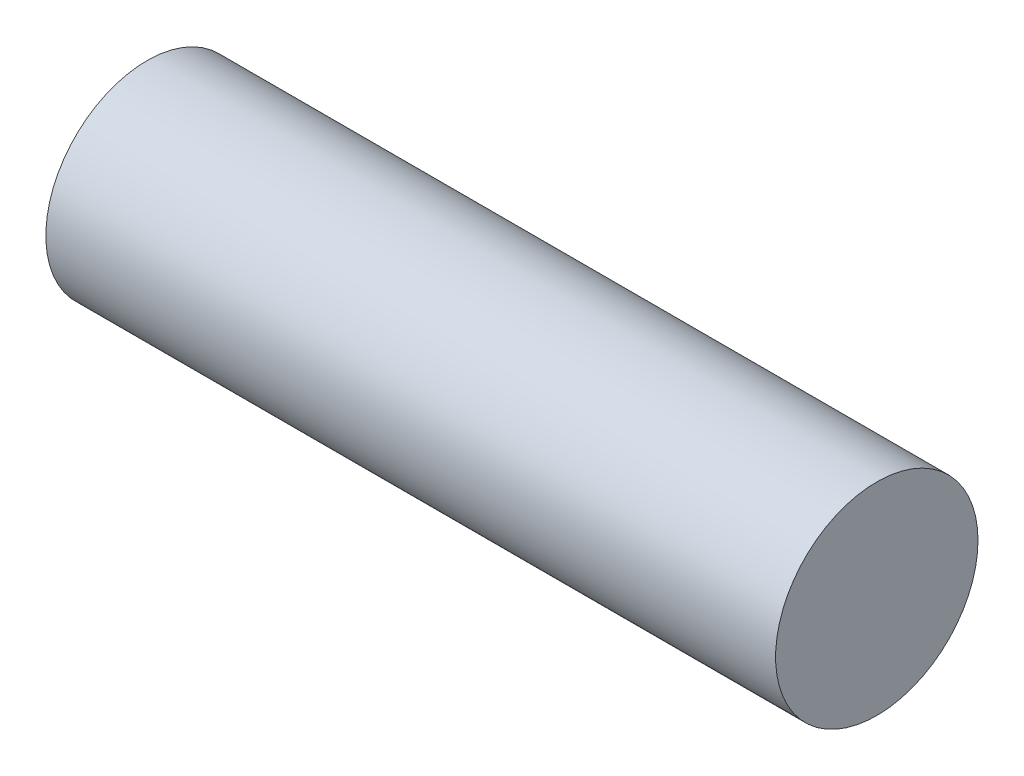
ISO-10303-21;
HEADER;
FILE_DESCRIPTION(('STEP AP214'),'2;1');
FILE_NAME('part.step','',(''),(''),'','','');
FILE_SCHEMA(('AUTOMOTIVE_DESIGN { 1 0 10303 214 1 1 1 1 }'));
ENDSEC;
DATA;
#1=APPLICATION_CONTEXT('core data for automotive mechanical design processes');
#2=APPLICATION_PROTOCOL_DEFINITION('international standard','automotive_design',2000,#1);
#3=PRODUCT_CONTEXT('',#1,'mechanical');
#4=PRODUCT('Part','Part','',(#3));
#5=PRODUCT_RELATED_PRODUCT_CATEGORY('part','',(#4));
#6=PRODUCT_DEFINITION_FORMATION('','',#4);
#7=PRODUCT_DEFINITION_CONTEXT('part definition',#1,'design');
#8=PRODUCT_DEFINITION('design','',#6,#7);
#9=PRODUCT_DEFINITION_SHAPE('','',#8);
#10=(LENGTH_UNIT() NAMED_UNIT(*) SI_UNIT(.MILLI.,.METRE.));
#11=(NAMED_UNIT(*) PLANE_ANGLE_UNIT() SI_UNIT($,.RADIAN.));
#12=(NAMED_UNIT(*) SI_UNIT($,.STERADIAN.) SOLID_ANGLE_UNIT());
#13=UNCERTAINTY_MEASURE_WITH_UNIT(LENGTH_MEASURE(1.E-05),#10,'distance_accuracy_value','');
#14=(GEOMETRIC_REPRESENTATION_CONTEXT(3) GLOBAL_UNCERTAINTY_ASSIGNED_CONTEXT((#13)) GLOBAL_UNIT_ASSIGNED_CONTEXT((#10,
#11,#12)) REPRESENTATION_CONTEXT('',''));
#15=CARTESIAN_POINT('',(0.,0.,0.));
#16=DIRECTION('',(0.,0.,1.));
#17=DIRECTION('',(1.,0.,0.));
#18=AXIS2_PLACEMENT_3D('',#15,#16,#17);
#19=CARTESIAN_POINT('',(25.45,-18.05,-20.45));
#20=DIRECTION('',(-1.,0.,0.));
#21=DIRECTION('',(0.,0.,1.));
#22=AXIS2_PLACEMENT_3D('',#19,#20,#21);
#23=CYLINDRICAL_SURFACE('',#22,9.5);
#24=CARTESIAN_POINT('',(25.45,-18.05,-20.45));
#25=DIRECTION('',(1.,0.,0.));
#26=DIRECTION('',(0.,0.,-1.));
#27=AXIS2_PLACEMENT_3D('',#24,#25,#26);
#28=CIRCLE('',#27,9.5);
#29=CARTESIAN_POINT('',(25.45,-18.05,-29.95));
#30=VERTEX_POINT('',#29);
#31=EDGE_CURVE('E10',#30,#30,#28,.T.);
#32=ORIENTED_EDGE('',*,*,#31,.F.);
#33=EDGE_LOOP('',(#32));
#34=FACE_BOUND('',#33,.T.);
#35=CARTESIAN_POINT('',(-43.05,-18.05,-20.45));
#36=DIRECTION('',(1.,0.,0.));
#37=DIRECTION('',(0.,0.,-1.));
#38=AXIS2_PLACEMENT_3D('',#35,#36,#37);
#39=CIRCLE('',#38,9.5);
#40=CARTESIAN_POINT('',(-43.05,-18.05,-29.95));
#41=VERTEX_POINT('',#40);
#42=EDGE_CURVE('E37',#41,#41,#39,.T.);
#43=ORIENTED_EDGE('',*,*,#42,.T.);
#44=EDGE_LOOP('',(#43));
#45=FACE_BOUND('',#44,.T.);
#46=ADVANCED_FACE('F40',(#34,#45),#23,.T.);
#47=CARTESIAN_POINT('',(25.45,-18.05,-20.45));
#48=DIRECTION('',(1.,0.,0.));
#49=DIRECTION('',(0.,0.,-1.));
#50=AXIS2_PLACEMENT_3D('',#47,#48,#49);
#51=PLANE('',#50);
#52=ORIENTED_EDGE('',*,*,#31,.T.);
#53=EDGE_LOOP('',(#52));
#54=FACE_BOUND('',#53,.T.);
#55=ADVANCED_FACE('F55',(#54),#51,.T.);
#56=CARTESIAN_POINT('',(-43.05,-18.05,-20.45));
#57=DIRECTION('',(1.,0.,0.));
#58=DIRECTION('',(0.,0.,-1.));
#59=AXIS2_PLACEMENT_3D('',#56,#57,#58);
#60=PLANE('',#59);
#61=ORIENTED_EDGE('',*,*,#42,.F.);
#62=EDGE_LOOP('',(#61));
#63=FACE_BOUND('',#62,.T.);
#64=ADVANCED_FACE('F49',(#63),#60,.F.);
#65=CLOSED_SHELL('',(#46,#55,#64));
#66=MANIFOLD_SOLID_BREP('B2',#65);
#67=ADVANCED_BREP_SHAPE_REPRESENTATION('',(#18,#66),#14);
#68=SHAPE_DEFINITION_REPRESENTATION(#9,#67);
ENDSEC;
END-ISO-10303-21;
